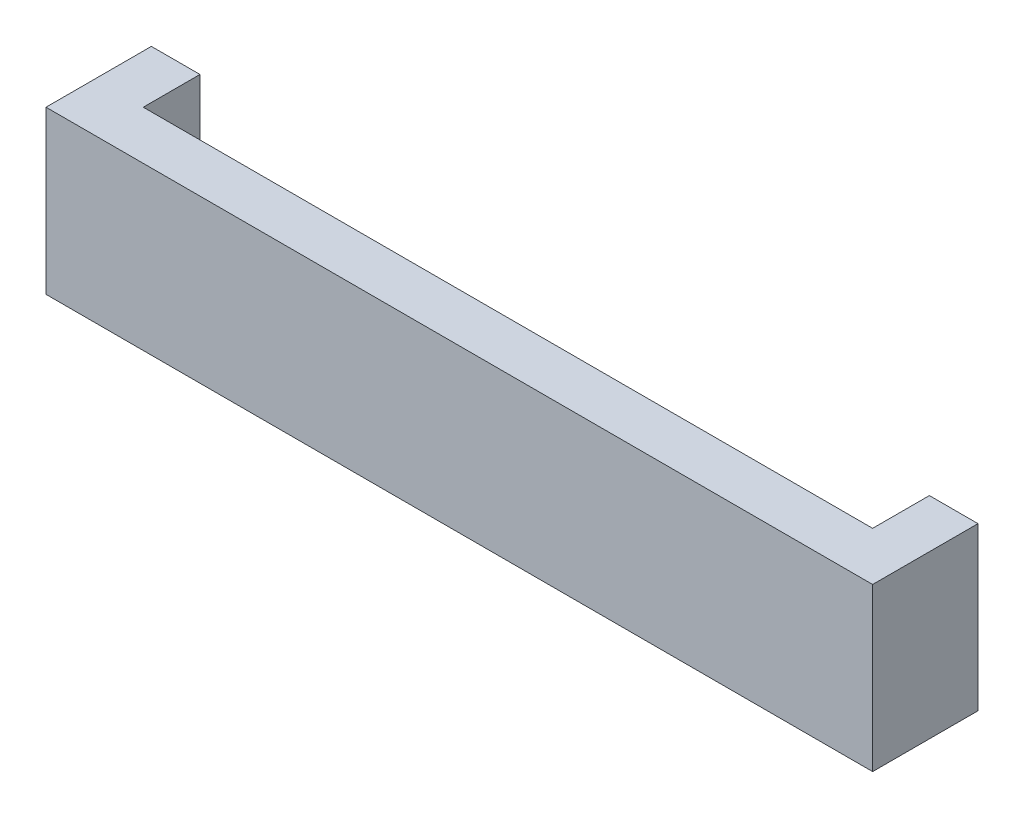
ISO-10303-21;
HEADER;
FILE_DESCRIPTION(('STEP AP214'),'2;1');
FILE_NAME('part.step','',(''),(''),'','','');
FILE_SCHEMA(('AUTOMOTIVE_DESIGN { 1 0 10303 214 1 1 1 1 }'));
ENDSEC;
DATA;
#1=APPLICATION_CONTEXT('core data for automotive mechanical design processes');
#2=APPLICATION_PROTOCOL_DEFINITION('international standard','automotive_design',2000,#1);
#3=PRODUCT_CONTEXT('',#1,'mechanical');
#4=PRODUCT('Part','Part','',(#3));
#5=PRODUCT_RELATED_PRODUCT_CATEGORY('part','',(#4));
#6=PRODUCT_DEFINITION_FORMATION('','',#4);
#7=PRODUCT_DEFINITION_CONTEXT('part definition',#1,'design');
#8=PRODUCT_DEFINITION('design','',#6,#7);
#9=PRODUCT_DEFINITION_SHAPE('','',#8);
#10=(LENGTH_UNIT() NAMED_UNIT(*) SI_UNIT(.MILLI.,.METRE.));
#11=(NAMED_UNIT(*) PLANE_ANGLE_UNIT() SI_UNIT($,.RADIAN.));
#12=(NAMED_UNIT(*) SI_UNIT($,.STERADIAN.) SOLID_ANGLE_UNIT());
#13=UNCERTAINTY_MEASURE_WITH_UNIT(LENGTH_MEASURE(1.E-05),#10,'distance_accuracy_value','');
#14=(GEOMETRIC_REPRESENTATION_CONTEXT(3) GLOBAL_UNCERTAINTY_ASSIGNED_CONTEXT((#13)) GLOBAL_UNIT_ASSIGNED_CONTEXT((#10,
#11,#12)) REPRESENTATION_CONTEXT('',''));
#15=CARTESIAN_POINT('',(0.,0.,0.));
#16=DIRECTION('',(0.,0.,1.));
#17=DIRECTION('',(1.,0.,0.));
#18=AXIS2_PLACEMENT_3D('',#15,#16,#17);
#19=CARTESIAN_POINT('',(0.,0.,0.));
#20=DIRECTION('',(0.,0.,-1.));
#21=DIRECTION('',(-1.,0.,0.));
#22=AXIS2_PLACEMENT_3D('',#19,#20,#21);
#23=PLANE('',#22);
#24=DIRECTION('',(0.,-1.,0.));
#25=VECTOR('',#24,1.);
#26=CARTESIAN_POINT('',(-22.5,5.,0.));
#27=LINE('',#26,#25);
#28=CARTESIAN_POINT('',(-22.5,5.,0.));
#29=VERTEX_POINT('',#28);
#30=CARTESIAN_POINT('',(-22.5,-5.,0.));
#31=VERTEX_POINT('',#30);
#32=EDGE_CURVE('E133',#29,#31,#27,.T.);
#33=ORIENTED_EDGE('',*,*,#32,.T.);
#34=DIRECTION('',(1.,0.,0.));
#35=VECTOR('',#34,1.);
#36=CARTESIAN_POINT('',(-25.5,-5.,0.));
#37=LINE('',#36,#35);
#38=CARTESIAN_POINT('',(-25.5,-5.,0.));
#39=VERTEX_POINT('',#38);
#40=EDGE_CURVE('E141',#39,#31,#37,.T.);
#41=ORIENTED_EDGE('',*,*,#40,.F.);
#42=DIRECTION('',(0.,-1.,0.));
#43=VECTOR('',#42,1.);
#44=CARTESIAN_POINT('',(-25.5,-5.,0.));
#45=LINE('',#44,#43);
#46=CARTESIAN_POINT('',(-25.5,5.,0.));
#47=VERTEX_POINT('',#46);
#48=EDGE_CURVE('E151',#47,#39,#45,.T.);
#49=ORIENTED_EDGE('',*,*,#48,.F.);
#50=DIRECTION('',(-1.,0.,0.));
#51=VECTOR('',#50,1.);
#52=CARTESIAN_POINT('',(-25.5,5.,0.));
#53=LINE('',#52,#51);
#54=EDGE_CURVE('E149',#29,#47,#53,.T.);
#55=ORIENTED_EDGE('',*,*,#54,.F.);
#56=EDGE_LOOP('',(#33,#41,#49,#55));
#57=FACE_BOUND('',#56,.T.);
#58=ADVANCED_FACE('F33',(#57),#23,.T.);
#59=CARTESIAN_POINT('',(25.5,-5.,6.5));
#60=DIRECTION('',(-1.,0.,0.));
#61=DIRECTION('',(0.,0.,1.));
#62=AXIS2_PLACEMENT_3D('',#59,#60,#61);
#63=PLANE('',#62);
#64=DIRECTION('',(0.,1.,0.));
#65=VECTOR('',#64,1.);
#66=CARTESIAN_POINT('',(25.5,-5.,0.));
#67=LINE('',#66,#65);
#68=CARTESIAN_POINT('',(25.5,-5.,0.));
#69=VERTEX_POINT('',#68);
#70=CARTESIAN_POINT('',(25.5,5.,0.));
#71=VERTEX_POINT('',#70);
#72=EDGE_CURVE('E136',#69,#71,#67,.T.);
#73=ORIENTED_EDGE('',*,*,#72,.T.);
#74=DIRECTION('',(0.,0.,-1.));
#75=VECTOR('',#74,1.);
#76=CARTESIAN_POINT('',(25.5,5.,6.5));
#77=LINE('',#76,#75);
#78=CARTESIAN_POINT('',(25.5,5.,6.5));
#79=VERTEX_POINT('',#78);
#80=EDGE_CURVE('E11',#79,#71,#77,.T.);
#81=ORIENTED_EDGE('',*,*,#80,.F.);
#82=DIRECTION('',(0.,1.,0.));
#83=VECTOR('',#82,1.);
#84=CARTESIAN_POINT('',(25.5,-5.,6.5));
#85=LINE('',#84,#83);
#86=CARTESIAN_POINT('',(25.5,-5.,6.5));
#87=VERTEX_POINT('',#86);
#88=EDGE_CURVE('E139',#87,#79,#85,.T.);
#89=ORIENTED_EDGE('',*,*,#88,.F.);
#90=DIRECTION('',(0.,0.,-1.));
#91=VECTOR('',#90,1.);
#92=CARTESIAN_POINT('',(25.5,-5.,6.5));
#93=LINE('',#92,#91);
#94=EDGE_CURVE('E146',#87,#69,#93,.T.);
#95=ORIENTED_EDGE('',*,*,#94,.T.);
#96=EDGE_LOOP('',(#73,#81,#89,#95));
#97=FACE_BOUND('',#96,.T.);
#98=ADVANCED_FACE('F35',(#97),#63,.F.);
#99=CARTESIAN_POINT('',(-25.5,5.,6.5));
#100=DIRECTION('',(0.,-1.,0.));
#101=DIRECTION('',(0.,0.,-1.));
#102=AXIS2_PLACEMENT_3D('',#99,#100,#101);
#103=PLANE('',#102);
#104=DIRECTION('',(-1.,0.,0.));
#105=VECTOR('',#104,1.);
#106=CARTESIAN_POINT('',(-22.5,5.,3.5));
#107=LINE('',#106,#105);
#108=CARTESIAN_POINT('',(22.5,5.,3.5));
#109=VERTEX_POINT('',#108);
#110=CARTESIAN_POINT('',(-22.5,5.,3.5));
#111=VERTEX_POINT('',#110);
#112=EDGE_CURVE('E116',#109,#111,#107,.T.);
#113=ORIENTED_EDGE('',*,*,#112,.T.);
#114=DIRECTION('',(0.,0.,-1.));
#115=VECTOR('',#114,1.);
#116=CARTESIAN_POINT('',(-22.5,5.,0.));
#117=LINE('',#116,#115);
#118=EDGE_CURVE('E120',#111,#29,#117,.T.);
#119=ORIENTED_EDGE('',*,*,#118,.T.);
#120=ORIENTED_EDGE('',*,*,#54,.T.);
#121=DIRECTION('',(0.,0.,-1.));
#122=VECTOR('',#121,1.);
#123=CARTESIAN_POINT('',(-25.5,5.,6.5));
#124=LINE('',#123,#122);
#125=CARTESIAN_POINT('',(-25.5,5.,6.5));
#126=VERTEX_POINT('',#125);
#127=EDGE_CURVE('E41',#126,#47,#124,.T.);
#128=ORIENTED_EDGE('',*,*,#127,.F.);
#129=DIRECTION('',(-1.,0.,0.));
#130=VECTOR('',#129,1.);
#131=CARTESIAN_POINT('',(-25.5,5.,6.5));
#132=LINE('',#131,#130);
#133=EDGE_CURVE('E85',#79,#126,#132,.T.);
#134=ORIENTED_EDGE('',*,*,#133,.F.);
#135=ORIENTED_EDGE('',*,*,#80,.T.);
#136=CARTESIAN_POINT('',(22.5,5.,0.));
#137=VERTEX_POINT('',#136);
#138=EDGE_CURVE('E124',#71,#137,#53,.T.);
#139=ORIENTED_EDGE('',*,*,#138,.T.);
#140=DIRECTION('',(0.,0.,1.));
#141=VECTOR('',#140,1.);
#142=CARTESIAN_POINT('',(22.5,5.,3.5));
#143=LINE('',#142,#141);
#144=EDGE_CURVE('E48',#137,#109,#143,.T.);
#145=ORIENTED_EDGE('',*,*,#144,.T.);
#146=EDGE_LOOP('',(#113,#119,#120,#128,#134,#135,#139,#145));
#147=FACE_BOUND('',#146,.T.);
#148=ADVANCED_FACE('F123',(#147),#103,.F.);
#149=CARTESIAN_POINT('',(-25.5,-5.,6.5));
#150=DIRECTION('',(1.,0.,0.));
#151=DIRECTION('',(0.,0.,-1.));
#152=AXIS2_PLACEMENT_3D('',#149,#150,#151);
#153=PLANE('',#152);
#154=ORIENTED_EDGE('',*,*,#48,.T.);
#155=DIRECTION('',(0.,0.,-1.));
#156=VECTOR('',#155,1.);
#157=CARTESIAN_POINT('',(-25.5,-5.,6.5));
#158=LINE('',#157,#156);
#159=CARTESIAN_POINT('',(-25.5,-5.,6.5));
#160=VERTEX_POINT('',#159);
#161=EDGE_CURVE('E156',#160,#39,#158,.T.);
#162=ORIENTED_EDGE('',*,*,#161,.F.);
#163=DIRECTION('',(0.,-1.,0.));
#164=VECTOR('',#163,1.);
#165=CARTESIAN_POINT('',(-25.5,-5.,6.5));
#166=LINE('',#165,#164);
#167=EDGE_CURVE('E143',#126,#160,#166,.T.);
#168=ORIENTED_EDGE('',*,*,#167,.F.);
#169=ORIENTED_EDGE('',*,*,#127,.T.);
#170=EDGE_LOOP('',(#154,#162,#168,#169));
#171=FACE_BOUND('',#170,.T.);
#172=ADVANCED_FACE('F162',(#171),#153,.F.);
#173=CARTESIAN_POINT('',(-25.5,-5.,6.5));
#174=DIRECTION('',(0.,1.,0.));
#175=DIRECTION('',(0.,0.,1.));
#176=AXIS2_PLACEMENT_3D('',#173,#174,#175);
#177=PLANE('',#176);
#178=ORIENTED_EDGE('',*,*,#40,.T.);
#179=DIRECTION('',(0.,0.,-1.));
#180=VECTOR('',#179,1.);
#181=CARTESIAN_POINT('',(-22.5,-5.,0.));
#182=LINE('',#181,#180);
#183=CARTESIAN_POINT('',(-22.5,-5.,3.5));
#184=VERTEX_POINT('',#183);
#185=EDGE_CURVE('E125',#184,#31,#182,.T.);
#186=ORIENTED_EDGE('',*,*,#185,.F.);
#187=DIRECTION('',(-1.,0.,0.));
#188=VECTOR('',#187,1.);
#189=CARTESIAN_POINT('',(-22.5,-5.,3.5));
#190=LINE('',#189,#188);
#191=CARTESIAN_POINT('',(22.5,-5.,3.5));
#192=VERTEX_POINT('',#191);
#193=EDGE_CURVE('E127',#192,#184,#190,.T.);
#194=ORIENTED_EDGE('',*,*,#193,.F.);
#195=DIRECTION('',(0.,0.,1.));
#196=VECTOR('',#195,1.);
#197=CARTESIAN_POINT('',(22.5,-5.,3.5));
#198=LINE('',#197,#196);
#199=CARTESIAN_POINT('',(22.5,-5.,0.));
#200=VERTEX_POINT('',#199);
#201=EDGE_CURVE('E108',#200,#192,#198,.T.);
#202=ORIENTED_EDGE('',*,*,#201,.F.);
#203=EDGE_CURVE('E78',#200,#69,#37,.T.);
#204=ORIENTED_EDGE('',*,*,#203,.T.);
#205=ORIENTED_EDGE('',*,*,#94,.F.);
#206=DIRECTION('',(1.,0.,0.));
#207=VECTOR('',#206,1.);
#208=CARTESIAN_POINT('',(-25.5,-5.,6.5));
#209=LINE('',#208,#207);
#210=EDGE_CURVE('E57',#160,#87,#209,.T.);
#211=ORIENTED_EDGE('',*,*,#210,.F.);
#212=ORIENTED_EDGE('',*,*,#161,.T.);
#213=EDGE_LOOP('',(#178,#186,#194,#202,#204,#205,#211,#212));
#214=FACE_BOUND('',#213,.T.);
#215=ADVANCED_FACE('F168',(#214),#177,.F.);
#216=CARTESIAN_POINT('',(0.,0.,6.5));
#217=DIRECTION('',(0.,0.,-1.));
#218=DIRECTION('',(-1.,0.,0.));
#219=AXIS2_PLACEMENT_3D('',#216,#217,#218);
#220=PLANE('',#219);
#221=ORIENTED_EDGE('',*,*,#88,.T.);
#222=ORIENTED_EDGE('',*,*,#133,.T.);
#223=ORIENTED_EDGE('',*,*,#167,.T.);
#224=ORIENTED_EDGE('',*,*,#210,.T.);
#225=EDGE_LOOP('',(#221,#222,#223,#224));
#226=FACE_BOUND('',#225,.T.);
#227=ADVANCED_FACE('F173',(#226),#220,.F.);
#228=DIRECTION('',(0.,-1.,0.));
#229=VECTOR('',#228,1.);
#230=CARTESIAN_POINT('',(22.5,5.,0.));
#231=LINE('',#230,#229);
#232=EDGE_CURVE('E113',#137,#200,#231,.T.);
#233=ORIENTED_EDGE('',*,*,#232,.F.);
#234=ORIENTED_EDGE('',*,*,#138,.F.);
#235=ORIENTED_EDGE('',*,*,#72,.F.);
#236=ORIENTED_EDGE('',*,*,#203,.F.);
#237=EDGE_LOOP('',(#233,#234,#235,#236));
#238=FACE_BOUND('',#237,.T.);
#239=ADVANCED_FACE('F175',(#238),#23,.T.);
#240=CARTESIAN_POINT('',(-22.5,5.,0.));
#241=DIRECTION('',(-1.,0.,0.));
#242=DIRECTION('',(0.,0.,1.));
#243=AXIS2_PLACEMENT_3D('',#240,#241,#242);
#244=PLANE('',#243);
#245=ORIENTED_EDGE('',*,*,#185,.T.);
#246=ORIENTED_EDGE('',*,*,#32,.F.);
#247=ORIENTED_EDGE('',*,*,#118,.F.);
#248=DIRECTION('',(0.,-1.,0.));
#249=VECTOR('',#248,1.);
#250=CARTESIAN_POINT('',(-22.5,5.,3.5));
#251=LINE('',#250,#249);
#252=EDGE_CURVE('E112',#111,#184,#251,.T.);
#253=ORIENTED_EDGE('',*,*,#252,.T.);
#254=EDGE_LOOP('',(#245,#246,#247,#253));
#255=FACE_BOUND('',#254,.T.);
#256=ADVANCED_FACE('F181',(#255),#244,.F.);
#257=CARTESIAN_POINT('',(-22.5,5.,3.5));
#258=DIRECTION('',(0.,0.,1.));
#259=DIRECTION('',(1.,0.,0.));
#260=AXIS2_PLACEMENT_3D('',#257,#258,#259);
#261=PLANE('',#260);
#262=ORIENTED_EDGE('',*,*,#193,.T.);
#263=ORIENTED_EDGE('',*,*,#252,.F.);
#264=ORIENTED_EDGE('',*,*,#112,.F.);
#265=DIRECTION('',(0.,-1.,0.));
#266=VECTOR('',#265,1.);
#267=CARTESIAN_POINT('',(22.5,5.,3.5));
#268=LINE('',#267,#266);
#269=EDGE_CURVE('E105',#109,#192,#268,.T.);
#270=ORIENTED_EDGE('',*,*,#269,.T.);
#271=EDGE_LOOP('',(#262,#263,#264,#270));
#272=FACE_BOUND('',#271,.T.);
#273=ADVANCED_FACE('F117',(#272),#261,.F.);
#274=CARTESIAN_POINT('',(22.5,5.,3.5));
#275=DIRECTION('',(1.,0.,0.));
#276=DIRECTION('',(0.,0.,-1.));
#277=AXIS2_PLACEMENT_3D('',#274,#275,#276);
#278=PLANE('',#277);
#279=ORIENTED_EDGE('',*,*,#201,.T.);
#280=ORIENTED_EDGE('',*,*,#269,.F.);
#281=ORIENTED_EDGE('',*,*,#144,.F.);
#282=ORIENTED_EDGE('',*,*,#232,.T.);
#283=EDGE_LOOP('',(#279,#280,#281,#282));
#284=FACE_BOUND('',#283,.T.);
#285=ADVANCED_FACE('F107',(#284),#278,.F.);
#286=CLOSED_SHELL('',(#58,#98,#148,#172,#215,#227,#239,#256,#273,#285));
#287=MANIFOLD_SOLID_BREP('B2',#286);
#288=ADVANCED_BREP_SHAPE_REPRESENTATION('',(#18,#287),#14);
#289=SHAPE_DEFINITION_REPRESENTATION(#9,#288);
ENDSEC;
END-ISO-10303-21;
